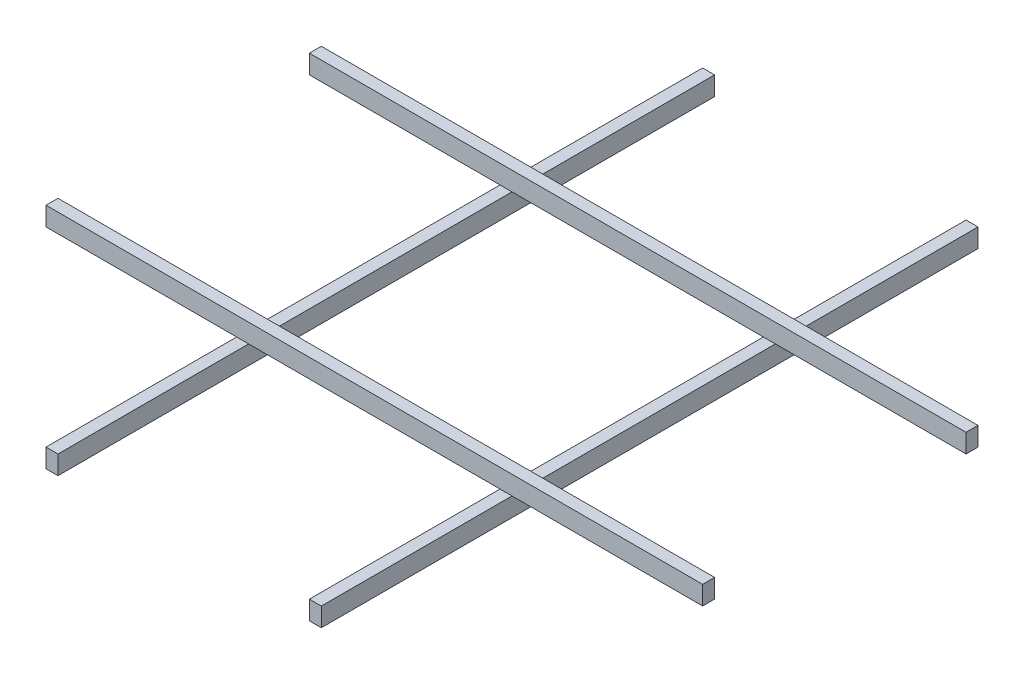
ISO-10303-21;
HEADER;
FILE_DESCRIPTION(('STEP AP214'),'2;1');
FILE_NAME('part.step','',(''),(''),'','','');
FILE_SCHEMA(('AUTOMOTIVE_DESIGN { 1 0 10303 214 1 1 1 1 }'));
ENDSEC;
DATA;
#1=APPLICATION_CONTEXT('core data for automotive mechanical design processes');
#2=APPLICATION_PROTOCOL_DEFINITION('international standard','automotive_design',2000,#1);
#3=PRODUCT_CONTEXT('',#1,'mechanical');
#4=PRODUCT('Part','Part','',(#3));
#5=PRODUCT_RELATED_PRODUCT_CATEGORY('part','',(#4));
#6=PRODUCT_DEFINITION_FORMATION('','',#4);
#7=PRODUCT_DEFINITION_CONTEXT('part definition',#1,'design');
#8=PRODUCT_DEFINITION('design','',#6,#7);
#9=PRODUCT_DEFINITION_SHAPE('','',#8);
#10=(LENGTH_UNIT() NAMED_UNIT(*) SI_UNIT(.MILLI.,.METRE.));
#11=(NAMED_UNIT(*) PLANE_ANGLE_UNIT() SI_UNIT($,.RADIAN.));
#12=(NAMED_UNIT(*) SI_UNIT($,.STERADIAN.) SOLID_ANGLE_UNIT());
#13=UNCERTAINTY_MEASURE_WITH_UNIT(LENGTH_MEASURE(1.E-05),#10,'distance_accuracy_value','');
#14=(GEOMETRIC_REPRESENTATION_CONTEXT(3) GLOBAL_UNCERTAINTY_ASSIGNED_CONTEXT((#13)) GLOBAL_UNIT_ASSIGNED_CONTEXT((#10,
#11,#12)) REPRESENTATION_CONTEXT('',''));
#15=CARTESIAN_POINT('',(0.,0.,0.));
#16=DIRECTION('',(0.,0.,1.));
#17=DIRECTION('',(1.,0.,0.));
#18=AXIS2_PLACEMENT_3D('',#15,#16,#17);
#19=CARTESIAN_POINT('',(4572.,209.55,-1504.95));
#20=DIRECTION('',(0.,0.,1.));
#21=DIRECTION('',(0.,-1.,0.));
#22=AXIS2_PLACEMENT_3D('',#19,#20,#21);
#23=PLANE('',#22);
#24=DIRECTION('',(0.,1.,0.));
#25=VECTOR('',#24,1.);
#26=CARTESIAN_POINT('',(-304.8,209.55,-1504.95));
#27=LINE('',#26,#25);
#28=CARTESIAN_POINT('',(-304.8,69.85,-1504.95));
#29=VERTEX_POINT('',#28);
#30=CARTESIAN_POINT('',(-304.8,209.55,-1504.95));
#31=VERTEX_POINT('',#30);
#32=EDGE_CURVE('E130',#29,#31,#27,.T.);
#33=ORIENTED_EDGE('',*,*,#32,.T.);
#34=DIRECTION('',(-1.,0.,0.));
#35=VECTOR('',#34,1.);
#36=CARTESIAN_POINT('',(4572.,209.55,-1504.95));
#37=LINE('',#36,#35);
#38=CARTESIAN_POINT('',(4572.,209.55,-1504.95));
#39=VERTEX_POINT('',#38);
#40=EDGE_CURVE('E13',#39,#31,#37,.T.);
#41=ORIENTED_EDGE('',*,*,#40,.F.);
#42=DIRECTION('',(0.,1.,0.));
#43=VECTOR('',#42,1.);
#44=CARTESIAN_POINT('',(4572.,209.55,-1504.95));
#45=LINE('',#44,#43);
#46=CARTESIAN_POINT('',(4572.,69.85,-1504.95));
#47=VERTEX_POINT('',#46);
#48=EDGE_CURVE('E118',#47,#39,#45,.T.);
#49=ORIENTED_EDGE('',*,*,#48,.F.);
#50=DIRECTION('',(-1.,0.,0.));
#51=VECTOR('',#50,1.);
#52=CARTESIAN_POINT('',(4572.,69.85,-1504.95));
#53=LINE('',#52,#51);
#54=EDGE_CURVE('E126',#47,#29,#53,.T.);
#55=ORIENTED_EDGE('',*,*,#54,.T.);
#56=EDGE_LOOP('',(#33,#41,#49,#55));
#57=FACE_BOUND('',#56,.T.);
#58=ADVANCED_FACE('F67',(#57),#23,.F.);
#59=CARTESIAN_POINT('',(4572.,209.55,-1416.05));
#60=DIRECTION('',(0.,-1.,0.));
#61=DIRECTION('',(0.,0.,-1.));
#62=AXIS2_PLACEMENT_3D('',#59,#60,#61);
#63=PLANE('',#62);
#64=DIRECTION('',(0.,0.,1.));
#65=VECTOR('',#64,1.);
#66=CARTESIAN_POINT('',(-304.8,209.55,-1416.05));
#67=LINE('',#66,#65);
#68=CARTESIAN_POINT('',(-304.8,209.55,-1416.05));
#69=VERTEX_POINT('',#68);
#70=EDGE_CURVE('E122',#31,#69,#67,.T.);
#71=ORIENTED_EDGE('',*,*,#70,.T.);
#72=DIRECTION('',(-1.,0.,0.));
#73=VECTOR('',#72,1.);
#74=CARTESIAN_POINT('',(4572.,209.55,-1416.05));
#75=LINE('',#74,#73);
#76=CARTESIAN_POINT('',(4572.,209.55,-1416.05));
#77=VERTEX_POINT('',#76);
#78=EDGE_CURVE('E75',#77,#69,#75,.T.);
#79=ORIENTED_EDGE('',*,*,#78,.F.);
#80=DIRECTION('',(0.,0.,1.));
#81=VECTOR('',#80,1.);
#82=CARTESIAN_POINT('',(4572.,209.55,-1416.05));
#83=LINE('',#82,#81);
#84=EDGE_CURVE('E113',#39,#77,#83,.T.);
#85=ORIENTED_EDGE('',*,*,#84,.F.);
#86=ORIENTED_EDGE('',*,*,#40,.T.);
#87=EDGE_LOOP('',(#71,#79,#85,#86));
#88=FACE_BOUND('',#87,.T.);
#89=ADVANCED_FACE('F121',(#88),#63,.F.);
#90=CARTESIAN_POINT('',(4572.,209.55,-1416.05));
#91=DIRECTION('',(0.,0.,-1.));
#92=DIRECTION('',(0.,1.,0.));
#93=AXIS2_PLACEMENT_3D('',#90,#91,#92);
#94=PLANE('',#93);
#95=DIRECTION('',(0.,-1.,0.));
#96=VECTOR('',#95,1.);
#97=CARTESIAN_POINT('',(-304.8,209.55,-1416.05));
#98=LINE('',#97,#96);
#99=CARTESIAN_POINT('',(-304.8,69.85,-1416.05));
#100=VERTEX_POINT('',#99);
#101=EDGE_CURVE('E100',#69,#100,#98,.T.);
#102=ORIENTED_EDGE('',*,*,#101,.T.);
#103=DIRECTION('',(-1.,0.,0.));
#104=VECTOR('',#103,1.);
#105=CARTESIAN_POINT('',(4572.,69.85,-1416.05));
#106=LINE('',#105,#104);
#107=CARTESIAN_POINT('',(4572.,69.85,-1416.05));
#108=VERTEX_POINT('',#107);
#109=EDGE_CURVE('E123',#108,#100,#106,.T.);
#110=ORIENTED_EDGE('',*,*,#109,.F.);
#111=DIRECTION('',(0.,-1.,0.));
#112=VECTOR('',#111,1.);
#113=CARTESIAN_POINT('',(4572.,209.55,-1416.05));
#114=LINE('',#113,#112);
#115=EDGE_CURVE('E116',#77,#108,#114,.T.);
#116=ORIENTED_EDGE('',*,*,#115,.F.);
#117=ORIENTED_EDGE('',*,*,#78,.T.);
#118=EDGE_LOOP('',(#102,#110,#116,#117));
#119=FACE_BOUND('',#118,.T.);
#120=ADVANCED_FACE('F124',(#119),#94,.F.);
#121=CARTESIAN_POINT('',(4572.,69.85,-1416.05));
#122=DIRECTION('',(0.,1.,0.));
#123=DIRECTION('',(0.,0.,1.));
#124=AXIS2_PLACEMENT_3D('',#121,#122,#123);
#125=PLANE('',#124);
#126=DIRECTION('',(0.,0.,-1.));
#127=VECTOR('',#126,1.);
#128=CARTESIAN_POINT('',(-304.8,69.85,-1416.05));
#129=LINE('',#128,#127);
#130=EDGE_CURVE('E106',#100,#29,#129,.T.);
#131=ORIENTED_EDGE('',*,*,#130,.T.);
#132=ORIENTED_EDGE('',*,*,#54,.F.);
#133=DIRECTION('',(0.,0.,-1.));
#134=VECTOR('',#133,1.);
#135=CARTESIAN_POINT('',(4572.,69.85,-1416.05));
#136=LINE('',#135,#134);
#137=EDGE_CURVE('E83',#108,#47,#136,.T.);
#138=ORIENTED_EDGE('',*,*,#137,.F.);
#139=ORIENTED_EDGE('',*,*,#109,.T.);
#140=EDGE_LOOP('',(#131,#132,#138,#139));
#141=FACE_BOUND('',#140,.T.);
#142=ADVANCED_FACE('F137',(#141),#125,.F.);
#143=CARTESIAN_POINT('',(4572.,139.7,-2616.2));
#144=DIRECTION('',(1.,0.,0.));
#145=DIRECTION('',(0.,0.,-1.));
#146=AXIS2_PLACEMENT_3D('',#143,#144,#145);
#147=PLANE('',#146);
#148=ORIENTED_EDGE('',*,*,#48,.T.);
#149=ORIENTED_EDGE('',*,*,#84,.T.);
#150=ORIENTED_EDGE('',*,*,#115,.T.);
#151=ORIENTED_EDGE('',*,*,#137,.T.);
#152=EDGE_LOOP('',(#148,#149,#150,#151));
#153=FACE_BOUND('',#152,.T.);
#154=ADVANCED_FACE('F114',(#153),#147,.T.);
#155=CARTESIAN_POINT('',(-304.8,139.7,-2616.2));
#156=DIRECTION('',(1.,0.,0.));
#157=DIRECTION('',(0.,0.,-1.));
#158=AXIS2_PLACEMENT_3D('',#155,#156,#157);
#159=PLANE('',#158);
#160=ORIENTED_EDGE('',*,*,#32,.F.);
#161=ORIENTED_EDGE('',*,*,#130,.F.);
#162=ORIENTED_EDGE('',*,*,#101,.F.);
#163=ORIENTED_EDGE('',*,*,#70,.F.);
#164=EDGE_LOOP('',(#160,#161,#162,#163));
#165=FACE_BOUND('',#164,.T.);
#166=ADVANCED_FACE('F140',(#165),#159,.F.);
#167=CLOSED_SHELL('',(#58,#89,#120,#142,#154,#166));
#168=MANIFOLD_SOLID_BREP('B2',#167);
#169=CARTESIAN_POINT('',(4572.,209.55,-3460.75));
#170=DIRECTION('',(0.,0.,1.));
#171=DIRECTION('',(0.,-1.,0.));
#172=AXIS2_PLACEMENT_3D('',#169,#170,#171);
#173=PLANE('',#172);
#174=DIRECTION('',(0.,1.,0.));
#175=VECTOR('',#174,1.);
#176=CARTESIAN_POINT('',(-304.8,209.55,-3460.75));
#177=LINE('',#176,#175);
#178=CARTESIAN_POINT('',(-304.8,69.85,-3460.75));
#179=VERTEX_POINT('',#178);
#180=CARTESIAN_POINT('',(-304.8,209.55,-3460.75));
#181=VERTEX_POINT('',#180);
#182=EDGE_CURVE('E289',#179,#181,#177,.T.);
#183=ORIENTED_EDGE('',*,*,#182,.T.);
#184=DIRECTION('',(-1.,0.,0.));
#185=VECTOR('',#184,1.);
#186=CARTESIAN_POINT('',(4572.,209.55,-3460.75));
#187=LINE('',#186,#185);
#188=CARTESIAN_POINT('',(4572.,209.55,-3460.75));
#189=VERTEX_POINT('',#188);
#190=EDGE_CURVE('E65',#189,#181,#187,.T.);
#191=ORIENTED_EDGE('',*,*,#190,.F.);
#192=DIRECTION('',(0.,1.,0.));
#193=VECTOR('',#192,1.);
#194=CARTESIAN_POINT('',(4572.,209.55,-3460.75));
#195=LINE('',#194,#193);
#196=CARTESIAN_POINT('',(4572.,69.85,-3460.75));
#197=VERTEX_POINT('',#196);
#198=EDGE_CURVE('E276',#197,#189,#195,.T.);
#199=ORIENTED_EDGE('',*,*,#198,.F.);
#200=DIRECTION('',(-1.,0.,0.));
#201=VECTOR('',#200,1.);
#202=CARTESIAN_POINT('',(4572.,69.85,-3460.75));
#203=LINE('',#202,#201);
#204=EDGE_CURVE('E285',#197,#179,#203,.T.);
#205=ORIENTED_EDGE('',*,*,#204,.T.);
#206=EDGE_LOOP('',(#183,#191,#199,#205));
#207=FACE_BOUND('',#206,.T.);
#208=ADVANCED_FACE('F224',(#207),#173,.F.);
#209=CARTESIAN_POINT('',(4572.,209.55,-3371.85));
#210=DIRECTION('',(0.,-1.,0.));
#211=DIRECTION('',(0.,0.,-1.));
#212=AXIS2_PLACEMENT_3D('',#209,#210,#211);
#213=PLANE('',#212);
#214=DIRECTION('',(0.,0.,1.));
#215=VECTOR('',#214,1.);
#216=CARTESIAN_POINT('',(-304.8,209.55,-3371.85));
#217=LINE('',#216,#215);
#218=CARTESIAN_POINT('',(-304.8,209.55,-3371.85));
#219=VERTEX_POINT('',#218);
#220=EDGE_CURVE('E280',#181,#219,#217,.T.);
#221=ORIENTED_EDGE('',*,*,#220,.T.);
#222=DIRECTION('',(-1.,0.,0.));
#223=VECTOR('',#222,1.);
#224=CARTESIAN_POINT('',(4572.,209.55,-3371.85));
#225=LINE('',#224,#223);
#226=CARTESIAN_POINT('',(4572.,209.55,-3371.85));
#227=VERTEX_POINT('',#226);
#228=EDGE_CURVE('E233',#227,#219,#225,.T.);
#229=ORIENTED_EDGE('',*,*,#228,.F.);
#230=DIRECTION('',(0.,0.,1.));
#231=VECTOR('',#230,1.);
#232=CARTESIAN_POINT('',(4572.,209.55,-3371.85));
#233=LINE('',#232,#231);
#234=EDGE_CURVE('E271',#189,#227,#233,.T.);
#235=ORIENTED_EDGE('',*,*,#234,.F.);
#236=ORIENTED_EDGE('',*,*,#190,.T.);
#237=EDGE_LOOP('',(#221,#229,#235,#236));
#238=FACE_BOUND('',#237,.T.);
#239=ADVANCED_FACE('F279',(#238),#213,.F.);
#240=CARTESIAN_POINT('',(4572.,209.55,-3371.85));
#241=DIRECTION('',(0.,0.,-1.));
#242=DIRECTION('',(0.,1.,0.));
#243=AXIS2_PLACEMENT_3D('',#240,#241,#242);
#244=PLANE('',#243);
#245=DIRECTION('',(0.,-1.,0.));
#246=VECTOR('',#245,1.);
#247=CARTESIAN_POINT('',(-304.8,209.55,-3371.85));
#248=LINE('',#247,#246);
#249=CARTESIAN_POINT('',(-304.8,69.85,-3371.85));
#250=VERTEX_POINT('',#249);
#251=EDGE_CURVE('E258',#219,#250,#248,.T.);
#252=ORIENTED_EDGE('',*,*,#251,.T.);
#253=DIRECTION('',(-1.,0.,0.));
#254=VECTOR('',#253,1.);
#255=CARTESIAN_POINT('',(4572.,69.85,-3371.85));
#256=LINE('',#255,#254);
#257=CARTESIAN_POINT('',(4572.,69.85,-3371.85));
#258=VERTEX_POINT('',#257);
#259=EDGE_CURVE('E282',#258,#250,#256,.T.);
#260=ORIENTED_EDGE('',*,*,#259,.F.);
#261=DIRECTION('',(0.,-1.,0.));
#262=VECTOR('',#261,1.);
#263=CARTESIAN_POINT('',(4572.,209.55,-3371.85));
#264=LINE('',#263,#262);
#265=EDGE_CURVE('E274',#227,#258,#264,.T.);
#266=ORIENTED_EDGE('',*,*,#265,.F.);
#267=ORIENTED_EDGE('',*,*,#228,.T.);
#268=EDGE_LOOP('',(#252,#260,#266,#267));
#269=FACE_BOUND('',#268,.T.);
#270=ADVANCED_FACE('F283',(#269),#244,.F.);
#271=CARTESIAN_POINT('',(4572.,69.85,-3371.85));
#272=DIRECTION('',(0.,1.,0.));
#273=DIRECTION('',(0.,0.,1.));
#274=AXIS2_PLACEMENT_3D('',#271,#272,#273);
#275=PLANE('',#274);
#276=DIRECTION('',(0.,0.,-1.));
#277=VECTOR('',#276,1.);
#278=CARTESIAN_POINT('',(-304.8,69.85,-3371.85));
#279=LINE('',#278,#277);
#280=EDGE_CURVE('E264',#250,#179,#279,.T.);
#281=ORIENTED_EDGE('',*,*,#280,.T.);
#282=ORIENTED_EDGE('',*,*,#204,.F.);
#283=DIRECTION('',(0.,0.,-1.));
#284=VECTOR('',#283,1.);
#285=CARTESIAN_POINT('',(4572.,69.85,-3371.85));
#286=LINE('',#285,#284);
#287=EDGE_CURVE('E241',#258,#197,#286,.T.);
#288=ORIENTED_EDGE('',*,*,#287,.F.);
#289=ORIENTED_EDGE('',*,*,#259,.T.);
#290=EDGE_LOOP('',(#281,#282,#288,#289));
#291=FACE_BOUND('',#290,.T.);
#292=ADVANCED_FACE('F298',(#291),#275,.F.);
#293=CARTESIAN_POINT('',(4572.,139.7,-4572.));
#294=DIRECTION('',(1.,0.,0.));
#295=DIRECTION('',(0.,0.,-1.));
#296=AXIS2_PLACEMENT_3D('',#293,#294,#295);
#297=PLANE('',#296);
#298=ORIENTED_EDGE('',*,*,#198,.T.);
#299=ORIENTED_EDGE('',*,*,#234,.T.);
#300=ORIENTED_EDGE('',*,*,#265,.T.);
#301=ORIENTED_EDGE('',*,*,#287,.T.);
#302=EDGE_LOOP('',(#298,#299,#300,#301));
#303=FACE_BOUND('',#302,.T.);
#304=ADVANCED_FACE('F272',(#303),#297,.T.);
#305=CARTESIAN_POINT('',(-304.8,139.7,-4572.));
#306=DIRECTION('',(1.,0.,0.));
#307=DIRECTION('',(0.,0.,-1.));
#308=AXIS2_PLACEMENT_3D('',#305,#306,#307);
#309=PLANE('',#308);
#310=ORIENTED_EDGE('',*,*,#182,.F.);
#311=ORIENTED_EDGE('',*,*,#280,.F.);
#312=ORIENTED_EDGE('',*,*,#251,.F.);
#313=ORIENTED_EDGE('',*,*,#220,.F.);
#314=EDGE_LOOP('',(#310,#311,#312,#313));
#315=FACE_BOUND('',#314,.T.);
#316=ADVANCED_FACE('F301',(#315),#309,.F.);
#317=CLOSED_SHELL('',(#208,#239,#270,#292,#304,#316));
#318=MANIFOLD_SOLID_BREP('B7',#317);
#319=CARTESIAN_POINT('',(3067.05,69.85,-4876.8));
#320=DIRECTION('',(1.,0.,0.));
#321=DIRECTION('',(0.,1.,0.));
#322=AXIS2_PLACEMENT_3D('',#319,#320,#321);
#323=PLANE('',#322);
#324=DIRECTION('',(0.,1.,0.));
#325=VECTOR('',#324,1.);
#326=CARTESIAN_POINT('',(3067.05,69.85,2.12298645866189E-13));
#327=LINE('',#326,#325);
#328=CARTESIAN_POINT('',(3067.05,-69.85,2.12298645866189E-13));
#329=VERTEX_POINT('',#328);
#330=CARTESIAN_POINT('',(3067.05,69.85,2.12298645866189E-13));
#331=VERTEX_POINT('',#330);
#332=EDGE_CURVE('E453',#329,#331,#327,.T.);
#333=ORIENTED_EDGE('',*,*,#332,.T.);
#334=DIRECTION('',(0.,0.,1.));
#335=VECTOR('',#334,1.);
#336=CARTESIAN_POINT('',(3067.05,69.85,-4876.8));
#337=LINE('',#336,#335);
#338=CARTESIAN_POINT('',(3067.05,69.85,-4876.8));
#339=VERTEX_POINT('',#338);
#340=EDGE_CURVE('E222',#339,#331,#337,.T.);
#341=ORIENTED_EDGE('',*,*,#340,.F.);
#342=DIRECTION('',(0.,1.,0.));
#343=VECTOR('',#342,1.);
#344=CARTESIAN_POINT('',(3067.05,69.85,-4876.8));
#345=LINE('',#344,#343);
#346=CARTESIAN_POINT('',(3067.05,-69.85,-4876.8));
#347=VERTEX_POINT('',#346);
#348=EDGE_CURVE('E440',#347,#339,#345,.T.);
#349=ORIENTED_EDGE('',*,*,#348,.F.);
#350=DIRECTION('',(0.,0.,1.));
#351=VECTOR('',#350,1.);
#352=CARTESIAN_POINT('',(3067.05,-69.85,-4876.8));
#353=LINE('',#352,#351);
#354=EDGE_CURVE('E449',#347,#329,#353,.T.);
#355=ORIENTED_EDGE('',*,*,#354,.T.);
#356=EDGE_LOOP('',(#333,#341,#349,#355));
#357=FACE_BOUND('',#356,.T.);
#358=ADVANCED_FACE('F384',(#357),#323,.F.);
#359=CARTESIAN_POINT('',(3155.95,69.85,-4876.8));
#360=DIRECTION('',(0.,-1.,0.));
#361=DIRECTION('',(0.,0.,-1.));
#362=AXIS2_PLACEMENT_3D('',#359,#360,#361);
#363=PLANE('',#362);
#364=DIRECTION('',(1.,0.,0.));
#365=VECTOR('',#364,1.);
#366=CARTESIAN_POINT('',(3155.95,69.85,2.12298645866189E-13));
#367=LINE('',#366,#365);
#368=CARTESIAN_POINT('',(3155.95,69.85,2.12298645866189E-13));
#369=VERTEX_POINT('',#368);
#370=EDGE_CURVE('E444',#331,#369,#367,.T.);
#371=ORIENTED_EDGE('',*,*,#370,.T.);
#372=DIRECTION('',(0.,0.,1.));
#373=VECTOR('',#372,1.);
#374=CARTESIAN_POINT('',(3155.95,69.85,-4876.8));
#375=LINE('',#374,#373);
#376=CARTESIAN_POINT('',(3155.95,69.85,-4876.8));
#377=VERTEX_POINT('',#376);
#378=EDGE_CURVE('E393',#377,#369,#375,.T.);
#379=ORIENTED_EDGE('',*,*,#378,.F.);
#380=DIRECTION('',(1.,0.,0.));
#381=VECTOR('',#380,1.);
#382=CARTESIAN_POINT('',(3155.95,69.85,-4876.8));
#383=LINE('',#382,#381);
#384=EDGE_CURVE('E435',#339,#377,#383,.T.);
#385=ORIENTED_EDGE('',*,*,#384,.F.);
#386=ORIENTED_EDGE('',*,*,#340,.T.);
#387=EDGE_LOOP('',(#371,#379,#385,#386));
#388=FACE_BOUND('',#387,.T.);
#389=ADVANCED_FACE('F443',(#388),#363,.F.);
#390=CARTESIAN_POINT('',(3155.95,69.85,-4876.8));
#391=DIRECTION('',(-1.,0.,0.));
#392=DIRECTION('',(0.,-1.,0.));
#393=AXIS2_PLACEMENT_3D('',#390,#391,#392);
#394=PLANE('',#393);
#395=DIRECTION('',(0.,-1.,0.));
#396=VECTOR('',#395,1.);
#397=CARTESIAN_POINT('',(3155.95,69.85,2.12298645866189E-13));
#398=LINE('',#397,#396);
#399=CARTESIAN_POINT('',(3155.95,-69.85,2.12298645866189E-13));
#400=VERTEX_POINT('',#399);
#401=EDGE_CURVE('E422',#369,#400,#398,.T.);
#402=ORIENTED_EDGE('',*,*,#401,.T.);
#403=DIRECTION('',(0.,0.,1.));
#404=VECTOR('',#403,1.);
#405=CARTESIAN_POINT('',(3155.95,-69.85,-4876.8));
#406=LINE('',#405,#404);
#407=CARTESIAN_POINT('',(3155.95,-69.85,-4876.8));
#408=VERTEX_POINT('',#407);
#409=EDGE_CURVE('E446',#408,#400,#406,.T.);
#410=ORIENTED_EDGE('',*,*,#409,.F.);
#411=DIRECTION('',(0.,-1.,0.));
#412=VECTOR('',#411,1.);
#413=CARTESIAN_POINT('',(3155.95,69.85,-4876.8));
#414=LINE('',#413,#412);
#415=EDGE_CURVE('E438',#377,#408,#414,.T.);
#416=ORIENTED_EDGE('',*,*,#415,.F.);
#417=ORIENTED_EDGE('',*,*,#378,.T.);
#418=EDGE_LOOP('',(#402,#410,#416,#417));
#419=FACE_BOUND('',#418,.T.);
#420=ADVANCED_FACE('F447',(#419),#394,.F.);
#421=CARTESIAN_POINT('',(3155.95,-69.85,-4876.8));
#422=DIRECTION('',(0.,1.,0.));
#423=DIRECTION('',(0.,0.,1.));
#424=AXIS2_PLACEMENT_3D('',#421,#422,#423);
#425=PLANE('',#424);
#426=DIRECTION('',(-1.,0.,0.));
#427=VECTOR('',#426,1.);
#428=CARTESIAN_POINT('',(3155.95,-69.85,2.12298645866189E-13));
#429=LINE('',#428,#427);
#430=EDGE_CURVE('E428',#400,#329,#429,.T.);
#431=ORIENTED_EDGE('',*,*,#430,.T.);
#432=ORIENTED_EDGE('',*,*,#354,.F.);
#433=DIRECTION('',(-1.,0.,0.));
#434=VECTOR('',#433,1.);
#435=CARTESIAN_POINT('',(3155.95,-69.85,-4876.8));
#436=LINE('',#435,#434);
#437=EDGE_CURVE('E401',#408,#347,#436,.T.);
#438=ORIENTED_EDGE('',*,*,#437,.F.);
#439=ORIENTED_EDGE('',*,*,#409,.T.);
#440=EDGE_LOOP('',(#431,#432,#438,#439));
#441=FACE_BOUND('',#440,.T.);
#442=ADVANCED_FACE('F466',(#441),#425,.F.);
#443=CARTESIAN_POINT('',(1955.8,0.,-4876.8));
#444=DIRECTION('',(0.,0.,-1.));
#445=DIRECTION('',(-1.,0.,0.));
#446=AXIS2_PLACEMENT_3D('',#443,#444,#445);
#447=PLANE('',#446);
#448=ORIENTED_EDGE('',*,*,#348,.T.);
#449=ORIENTED_EDGE('',*,*,#384,.T.);
#450=ORIENTED_EDGE('',*,*,#415,.T.);
#451=ORIENTED_EDGE('',*,*,#437,.T.);
#452=EDGE_LOOP('',(#448,#449,#450,#451));
#453=FACE_BOUND('',#452,.T.);
#454=ADVANCED_FACE('F436',(#453),#447,.T.);
#455=CARTESIAN_POINT('',(1955.8,0.,2.12298645866189E-13));
#456=DIRECTION('',(0.,0.,-1.));
#457=DIRECTION('',(-1.,0.,0.));
#458=AXIS2_PLACEMENT_3D('',#455,#456,#457);
#459=PLANE('',#458);
#460=ORIENTED_EDGE('',*,*,#332,.F.);
#461=ORIENTED_EDGE('',*,*,#430,.F.);
#462=ORIENTED_EDGE('',*,*,#401,.F.);
#463=ORIENTED_EDGE('',*,*,#370,.F.);
#464=EDGE_LOOP('',(#460,#461,#462,#463));
#465=FACE_BOUND('',#464,.T.);
#466=ADVANCED_FACE('F469',(#465),#459,.F.);
#467=CLOSED_SHELL('',(#358,#389,#420,#442,#454,#466));
#468=MANIFOLD_SOLID_BREP('B59',#467);
#469=CARTESIAN_POINT('',(1111.25,69.85,-4876.8));
#470=DIRECTION('',(1.,0.,0.));
#471=DIRECTION('',(0.,1.,0.));
#472=AXIS2_PLACEMENT_3D('',#469,#470,#471);
#473=PLANE('',#472);
#474=DIRECTION('',(0.,1.,0.));
#475=VECTOR('',#474,1.);
#476=CARTESIAN_POINT('',(1111.25,69.85,8.88178419700125E-13));
#477=LINE('',#476,#475);
#478=CARTESIAN_POINT('',(1111.25,-69.85,8.88178419700125E-13));
#479=VERTEX_POINT('',#478);
#480=CARTESIAN_POINT('',(1111.25,69.85,8.88178419700125E-13));
#481=VERTEX_POINT('',#480);
#482=EDGE_CURVE('E608',#479,#481,#477,.T.);
#483=ORIENTED_EDGE('',*,*,#482,.T.);
#484=DIRECTION('',(0.,0.,1.));
#485=VECTOR('',#484,1.);
#486=CARTESIAN_POINT('',(1111.25,69.85,-4876.8));
#487=LINE('',#486,#485);
#488=CARTESIAN_POINT('',(1111.25,69.85,-4876.8));
#489=VERTEX_POINT('',#488);
#490=EDGE_CURVE('E382',#489,#481,#487,.T.);
#491=ORIENTED_EDGE('',*,*,#490,.F.);
#492=DIRECTION('',(0.,1.,0.));
#493=VECTOR('',#492,1.);
#494=CARTESIAN_POINT('',(1111.25,69.85,-4876.8));
#495=LINE('',#494,#493);
#496=CARTESIAN_POINT('',(1111.25,-69.85,-4876.8));
#497=VERTEX_POINT('',#496);
#498=EDGE_CURVE('E595',#497,#489,#495,.T.);
#499=ORIENTED_EDGE('',*,*,#498,.F.);
#500=DIRECTION('',(0.,0.,1.));
#501=VECTOR('',#500,1.);
#502=CARTESIAN_POINT('',(1111.25,-69.85,-4876.8));
#503=LINE('',#502,#501);
#504=EDGE_CURVE('E604',#497,#479,#503,.T.);
#505=ORIENTED_EDGE('',*,*,#504,.T.);
#506=EDGE_LOOP('',(#483,#491,#499,#505));
#507=FACE_BOUND('',#506,.T.);
#508=ADVANCED_FACE('F543',(#507),#473,.F.);
#509=CARTESIAN_POINT('',(1200.15,69.85,-4876.8));
#510=DIRECTION('',(0.,-1.,0.));
#511=DIRECTION('',(0.,0.,-1.));
#512=AXIS2_PLACEMENT_3D('',#509,#510,#511);
#513=PLANE('',#512);
#514=DIRECTION('',(1.,0.,0.));
#515=VECTOR('',#514,1.);
#516=CARTESIAN_POINT('',(1200.15,69.85,8.88178419700125E-13));
#517=LINE('',#516,#515);
#518=CARTESIAN_POINT('',(1200.15,69.85,8.88178419700125E-13));
#519=VERTEX_POINT('',#518);
#520=EDGE_CURVE('E599',#481,#519,#517,.T.);
#521=ORIENTED_EDGE('',*,*,#520,.T.);
#522=DIRECTION('',(0.,0.,1.));
#523=VECTOR('',#522,1.);
#524=CARTESIAN_POINT('',(1200.15,69.85,-4876.8));
#525=LINE('',#524,#523);
#526=CARTESIAN_POINT('',(1200.15,69.85,-4876.8));
#527=VERTEX_POINT('',#526);
#528=EDGE_CURVE('E551',#527,#519,#525,.T.);
#529=ORIENTED_EDGE('',*,*,#528,.F.);
#530=DIRECTION('',(1.,0.,0.));
#531=VECTOR('',#530,1.);
#532=CARTESIAN_POINT('',(1200.15,69.85,-4876.8));
#533=LINE('',#532,#531);
#534=EDGE_CURVE('E590',#489,#527,#533,.T.);
#535=ORIENTED_EDGE('',*,*,#534,.F.);
#536=ORIENTED_EDGE('',*,*,#490,.T.);
#537=EDGE_LOOP('',(#521,#529,#535,#536));
#538=FACE_BOUND('',#537,.T.);
#539=ADVANCED_FACE('F598',(#538),#513,.F.);
#540=CARTESIAN_POINT('',(1200.15,69.85,-4876.8));
#541=DIRECTION('',(-1.,0.,0.));
#542=DIRECTION('',(0.,-1.,0.));
#543=AXIS2_PLACEMENT_3D('',#540,#541,#542);
#544=PLANE('',#543);
#545=DIRECTION('',(0.,-1.,0.));
#546=VECTOR('',#545,1.);
#547=CARTESIAN_POINT('',(1200.15,69.85,8.88178419700125E-13));
#548=LINE('',#547,#546);
#549=CARTESIAN_POINT('',(1200.15,-69.85,8.88178419700125E-13));
#550=VERTEX_POINT('',#549);
#551=EDGE_CURVE('E577',#519,#550,#548,.T.);
#552=ORIENTED_EDGE('',*,*,#551,.T.);
#553=DIRECTION('',(0.,0.,1.));
#554=VECTOR('',#553,1.);
#555=CARTESIAN_POINT('',(1200.15,-69.85,-4876.8));
#556=LINE('',#555,#554);
#557=CARTESIAN_POINT('',(1200.15,-69.85,-4876.8));
#558=VERTEX_POINT('',#557);
#559=EDGE_CURVE('E600',#558,#550,#556,.T.);
#560=ORIENTED_EDGE('',*,*,#559,.F.);
#561=DIRECTION('',(0.,-1.,0.));
#562=VECTOR('',#561,1.);
#563=CARTESIAN_POINT('',(1200.15,69.85,-4876.8));
#564=LINE('',#563,#562);
#565=EDGE_CURVE('E593',#527,#558,#564,.T.);
#566=ORIENTED_EDGE('',*,*,#565,.F.);
#567=ORIENTED_EDGE('',*,*,#528,.T.);
#568=EDGE_LOOP('',(#552,#560,#566,#567));
#569=FACE_BOUND('',#568,.T.);
#570=ADVANCED_FACE('F601',(#569),#544,.F.);
#571=CARTESIAN_POINT('',(1200.15,-69.85,-4876.8));
#572=DIRECTION('',(0.,1.,0.));
#573=DIRECTION('',(0.,0.,1.));
#574=AXIS2_PLACEMENT_3D('',#571,#572,#573);
#575=PLANE('',#574);
#576=DIRECTION('',(-1.,0.,0.));
#577=VECTOR('',#576,1.);
#578=CARTESIAN_POINT('',(1200.15,-69.85,8.88178419700125E-13));
#579=LINE('',#578,#577);
#580=EDGE_CURVE('E583',#550,#479,#579,.T.);
#581=ORIENTED_EDGE('',*,*,#580,.T.);
#582=ORIENTED_EDGE('',*,*,#504,.F.);
#583=DIRECTION('',(-1.,0.,0.));
#584=VECTOR('',#583,1.);
#585=CARTESIAN_POINT('',(1200.15,-69.85,-4876.8));
#586=LINE('',#585,#584);
#587=EDGE_CURVE('E560',#558,#497,#586,.T.);
#588=ORIENTED_EDGE('',*,*,#587,.F.);
#589=ORIENTED_EDGE('',*,*,#559,.T.);
#590=EDGE_LOOP('',(#581,#582,#588,#589));
#591=FACE_BOUND('',#590,.T.);
#592=ADVANCED_FACE('F616',(#591),#575,.F.);
#593=CARTESIAN_POINT('',(0.,0.,-4876.8));
#594=DIRECTION('',(0.,0.,-1.));
#595=DIRECTION('',(-1.,0.,0.));
#596=AXIS2_PLACEMENT_3D('',#593,#594,#595);
#597=PLANE('',#596);
#598=ORIENTED_EDGE('',*,*,#498,.T.);
#599=ORIENTED_EDGE('',*,*,#534,.T.);
#600=ORIENTED_EDGE('',*,*,#565,.T.);
#601=ORIENTED_EDGE('',*,*,#587,.T.);
#602=EDGE_LOOP('',(#598,#599,#600,#601));
#603=FACE_BOUND('',#602,.T.);
#604=ADVANCED_FACE('F591',(#603),#597,.T.);
#605=CARTESIAN_POINT('',(0.,0.,8.88178419700125E-13));
#606=DIRECTION('',(0.,0.,-1.));
#607=DIRECTION('',(-1.,0.,0.));
#608=AXIS2_PLACEMENT_3D('',#605,#606,#607);
#609=PLANE('',#608);
#610=ORIENTED_EDGE('',*,*,#482,.F.);
#611=ORIENTED_EDGE('',*,*,#580,.F.);
#612=ORIENTED_EDGE('',*,*,#551,.F.);
#613=ORIENTED_EDGE('',*,*,#520,.F.);
#614=EDGE_LOOP('',(#610,#611,#612,#613));
#615=FACE_BOUND('',#614,.T.);
#616=ADVANCED_FACE('F619',(#615),#609,.F.);
#617=CLOSED_SHELL('',(#508,#539,#570,#592,#604,#616));
#618=MANIFOLD_SOLID_BREP('B216',#617);
#619=ADVANCED_BREP_SHAPE_REPRESENTATION('',(#18,#168,#318,#468,#618),#14);
#620=SHAPE_DEFINITION_REPRESENTATION(#9,#619);
ENDSEC;
END-ISO-10303-21;
